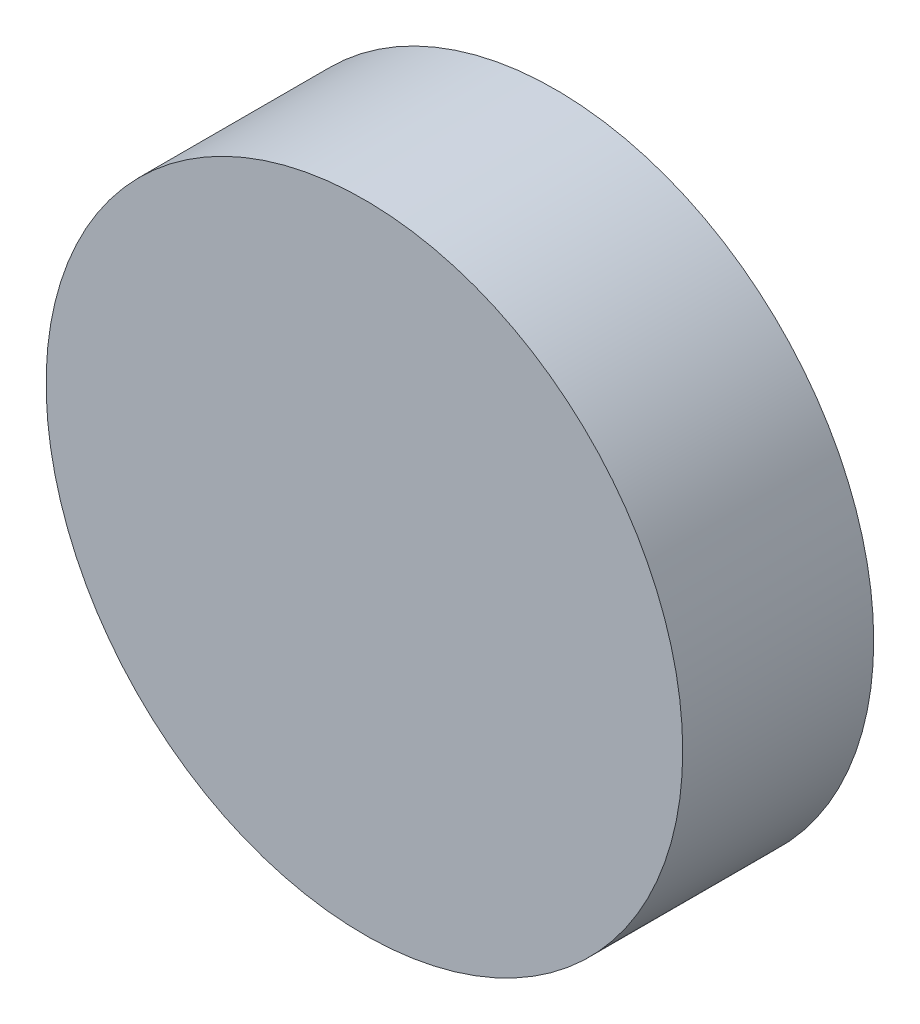
ISO-10303-21;
HEADER;
FILE_DESCRIPTION(('STEP AP214'),'2;1');
FILE_NAME('part.step','',(''),(''),'','','');
FILE_SCHEMA(('AUTOMOTIVE_DESIGN { 1 0 10303 214 1 1 1 1 }'));
ENDSEC;
DATA;
#1=APPLICATION_CONTEXT('core data for automotive mechanical design processes');
#2=APPLICATION_PROTOCOL_DEFINITION('international standard','automotive_design',2000,#1);
#3=PRODUCT_CONTEXT('',#1,'mechanical');
#4=PRODUCT('Part','Part','',(#3));
#5=PRODUCT_RELATED_PRODUCT_CATEGORY('part','',(#4));
#6=PRODUCT_DEFINITION_FORMATION('','',#4);
#7=PRODUCT_DEFINITION_CONTEXT('part definition',#1,'design');
#8=PRODUCT_DEFINITION('design','',#6,#7);
#9=PRODUCT_DEFINITION_SHAPE('','',#8);
#10=(LENGTH_UNIT() NAMED_UNIT(*) SI_UNIT(.MILLI.,.METRE.));
#11=(NAMED_UNIT(*) PLANE_ANGLE_UNIT() SI_UNIT($,.RADIAN.));
#12=(NAMED_UNIT(*) SI_UNIT($,.STERADIAN.) SOLID_ANGLE_UNIT());
#13=UNCERTAINTY_MEASURE_WITH_UNIT(LENGTH_MEASURE(1.E-05),#10,'distance_accuracy_value','');
#14=(GEOMETRIC_REPRESENTATION_CONTEXT(3) GLOBAL_UNCERTAINTY_ASSIGNED_CONTEXT((#13)) GLOBAL_UNIT_ASSIGNED_CONTEXT((#10,
#11,#12)) REPRESENTATION_CONTEXT('',''));
#15=CARTESIAN_POINT('',(0.,0.,0.));
#16=DIRECTION('',(0.,0.,1.));
#17=DIRECTION('',(1.,0.,0.));
#18=AXIS2_PLACEMENT_3D('',#15,#16,#17);
#19=CARTESIAN_POINT('',(0.,0.,1.5));
#20=DIRECTION('',(0.,0.,-1.));
#21=DIRECTION('',(-1.,0.,0.));
#22=AXIS2_PLACEMENT_3D('',#19,#20,#21);
#23=CYLINDRICAL_SURFACE('',#22,2.5);
#24=CARTESIAN_POINT('',(0.,0.,1.5));
#25=DIRECTION('',(0.,0.,1.));
#26=DIRECTION('',(1.,0.,0.));
#27=AXIS2_PLACEMENT_3D('',#24,#25,#26);
#28=CIRCLE('',#27,2.5);
#29=CARTESIAN_POINT('',(2.5,0.,1.5));
#30=VERTEX_POINT('',#29);
#31=EDGE_CURVE('E10',#30,#30,#28,.T.);
#32=ORIENTED_EDGE('',*,*,#31,.F.);
#33=EDGE_LOOP('',(#32));
#34=FACE_BOUND('',#33,.T.);
#35=CARTESIAN_POINT('',(0.,0.,0.));
#36=DIRECTION('',(0.,0.,1.));
#37=DIRECTION('',(1.,0.,0.));
#38=AXIS2_PLACEMENT_3D('',#35,#36,#37);
#39=CIRCLE('',#38,2.5);
#40=CARTESIAN_POINT('',(2.5,0.,0.));
#41=VERTEX_POINT('',#40);
#42=EDGE_CURVE('E34',#41,#41,#39,.T.);
#43=ORIENTED_EDGE('',*,*,#42,.T.);
#44=EDGE_LOOP('',(#43));
#45=FACE_BOUND('',#44,.T.);
#46=ADVANCED_FACE('F31',(#34,#45),#23,.T.);
#47=CARTESIAN_POINT('',(0.,0.,1.5));
#48=DIRECTION('',(0.,0.,1.));
#49=DIRECTION('',(1.,0.,0.));
#50=AXIS2_PLACEMENT_3D('',#47,#48,#49);
#51=PLANE('',#50);
#52=ORIENTED_EDGE('',*,*,#31,.T.);
#53=EDGE_LOOP('',(#52));
#54=FACE_BOUND('',#53,.T.);
#55=ADVANCED_FACE('F46',(#54),#51,.T.);
#56=CARTESIAN_POINT('',(0.,0.,0.));
#57=DIRECTION('',(0.,0.,1.));
#58=DIRECTION('',(1.,0.,0.));
#59=AXIS2_PLACEMENT_3D('',#56,#57,#58);
#60=PLANE('',#59);
#61=ORIENTED_EDGE('',*,*,#42,.F.);
#62=EDGE_LOOP('',(#61));
#63=FACE_BOUND('',#62,.T.);
#64=ADVANCED_FACE('F44',(#63),#60,.F.);
#65=CLOSED_SHELL('',(#46,#55,#64));
#66=MANIFOLD_SOLID_BREP('B2',#65);
#67=ADVANCED_BREP_SHAPE_REPRESENTATION('',(#18,#66),#14);
#68=SHAPE_DEFINITION_REPRESENTATION(#9,#67);
ENDSEC;
END-ISO-10303-21;
